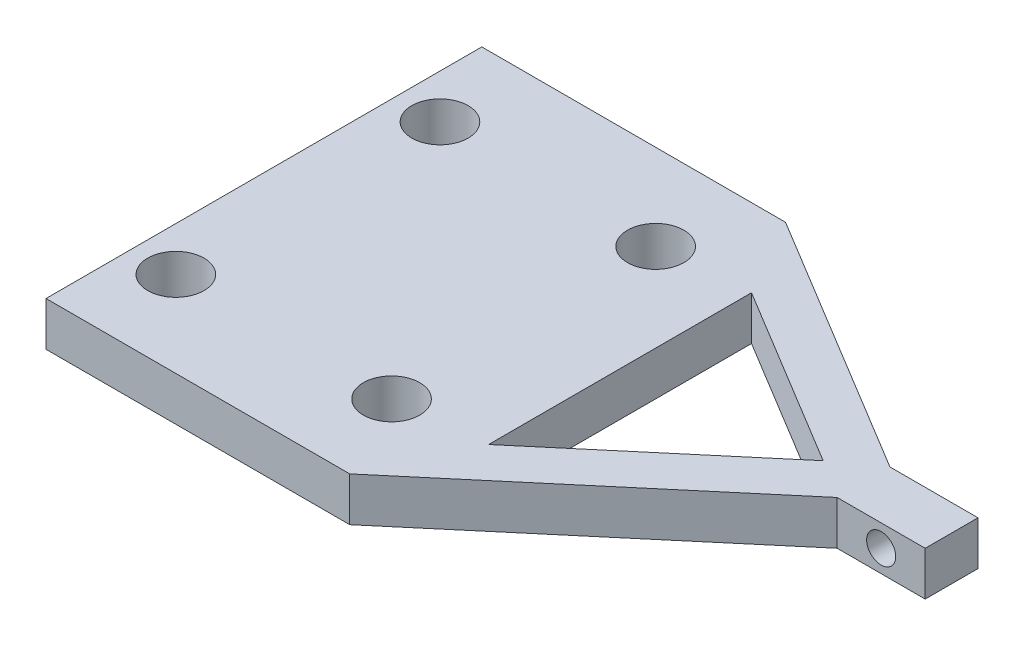
ISO-10303-21;
HEADER;
FILE_DESCRIPTION(('STEP AP214'),'2;1');
FILE_NAME('part.step','',(''),(''),'','','');
FILE_SCHEMA(('AUTOMOTIVE_DESIGN { 1 0 10303 214 1 1 1 1 }'));
ENDSEC;
DATA;
#1=APPLICATION_CONTEXT('core data for automotive mechanical design processes');
#2=APPLICATION_PROTOCOL_DEFINITION('international standard','automotive_design',2000,#1);
#3=PRODUCT_CONTEXT('',#1,'mechanical');
#4=PRODUCT('Part','Part','',(#3));
#5=PRODUCT_RELATED_PRODUCT_CATEGORY('part','',(#4));
#6=PRODUCT_DEFINITION_FORMATION('','',#4);
#7=PRODUCT_DEFINITION_CONTEXT('part definition',#1,'design');
#8=PRODUCT_DEFINITION('design','',#6,#7);
#9=PRODUCT_DEFINITION_SHAPE('','',#8);
#10=(LENGTH_UNIT() NAMED_UNIT(*) SI_UNIT(.MILLI.,.METRE.));
#11=(NAMED_UNIT(*) PLANE_ANGLE_UNIT() SI_UNIT($,.RADIAN.));
#12=(NAMED_UNIT(*) SI_UNIT($,.STERADIAN.) SOLID_ANGLE_UNIT());
#13=UNCERTAINTY_MEASURE_WITH_UNIT(LENGTH_MEASURE(1.E-05),#10,'distance_accuracy_value','');
#14=(GEOMETRIC_REPRESENTATION_CONTEXT(3) GLOBAL_UNCERTAINTY_ASSIGNED_CONTEXT((#13)) GLOBAL_UNIT_ASSIGNED_CONTEXT((#10,
#11,#12)) REPRESENTATION_CONTEXT('',''));
#15=CARTESIAN_POINT('',(0.,0.,0.));
#16=DIRECTION('',(0.,0.,1.));
#17=DIRECTION('',(1.,0.,0.));
#18=AXIS2_PLACEMENT_3D('',#15,#16,#17);
#19=CARTESIAN_POINT('',(0.,5.,0.));
#20=DIRECTION('',(1.,0.,0.));
#21=DIRECTION('',(0.,0.,-1.));
#22=AXIS2_PLACEMENT_3D('',#19,#20,#21);
#23=PLANE('',#22);
#24=DIRECTION('',(0.,0.,1.));
#25=VECTOR('',#24,1.);
#26=CARTESIAN_POINT('',(0.,0.,0.));
#27=LINE('',#26,#25);
#28=CARTESIAN_POINT('',(0.,0.,-49.5));
#29=VERTEX_POINT('',#28);
#30=CARTESIAN_POINT('',(0.,0.,0.));
#31=VERTEX_POINT('',#30);
#32=EDGE_CURVE('E225',#29,#31,#27,.T.);
#33=ORIENTED_EDGE('',*,*,#32,.T.);
#34=DIRECTION('',(0.,-1.,0.));
#35=VECTOR('',#34,1.);
#36=CARTESIAN_POINT('',(0.,5.,0.));
#37=LINE('',#36,#35);
#38=CARTESIAN_POINT('',(0.,5.,0.));
#39=VERTEX_POINT('',#38);
#40=EDGE_CURVE('E12',#39,#31,#37,.T.);
#41=ORIENTED_EDGE('',*,*,#40,.F.);
#42=DIRECTION('',(0.,0.,1.));
#43=VECTOR('',#42,1.);
#44=CARTESIAN_POINT('',(0.,5.,0.));
#45=LINE('',#44,#43);
#46=CARTESIAN_POINT('',(0.,5.,-49.5));
#47=VERTEX_POINT('',#46);
#48=EDGE_CURVE('E228',#47,#39,#45,.T.);
#49=ORIENTED_EDGE('',*,*,#48,.F.);
#50=DIRECTION('',(0.,-1.,0.));
#51=VECTOR('',#50,1.);
#52=CARTESIAN_POINT('',(0.,5.,-49.5));
#53=LINE('',#52,#51);
#54=EDGE_CURVE('E233',#47,#29,#53,.T.);
#55=ORIENTED_EDGE('',*,*,#54,.T.);
#56=EDGE_LOOP('',(#33,#41,#49,#55));
#57=FACE_BOUND('',#56,.T.);
#58=ADVANCED_FACE('F64',(#57),#23,.F.);
#59=CARTESIAN_POINT('',(0.,5.,0.));
#60=DIRECTION('',(0.,0.,-1.));
#61=DIRECTION('',(-1.,0.,0.));
#62=AXIS2_PLACEMENT_3D('',#59,#60,#61);
#63=PLANE('',#62);
#64=DIRECTION('',(1.,0.,0.));
#65=VECTOR('',#64,1.);
#66=CARTESIAN_POINT('',(0.,0.,0.));
#67=LINE('',#66,#65);
#68=CARTESIAN_POINT('',(34.5,0.,0.));
#69=VERTEX_POINT('',#68);
#70=EDGE_CURVE('E92',#31,#69,#67,.T.);
#71=ORIENTED_EDGE('',*,*,#70,.T.);
#72=DIRECTION('',(0.,-1.,0.));
#73=VECTOR('',#72,1.);
#74=CARTESIAN_POINT('',(34.5,5.,0.));
#75=LINE('',#74,#73);
#76=CARTESIAN_POINT('',(34.5,5.,0.));
#77=VERTEX_POINT('',#76);
#78=EDGE_CURVE('E72',#77,#69,#75,.T.);
#79=ORIENTED_EDGE('',*,*,#78,.F.);
#80=DIRECTION('',(1.,0.,0.));
#81=VECTOR('',#80,1.);
#82=CARTESIAN_POINT('',(0.,5.,0.));
#83=LINE('',#82,#81);
#84=EDGE_CURVE('E230',#39,#77,#83,.T.);
#85=ORIENTED_EDGE('',*,*,#84,.F.);
#86=ORIENTED_EDGE('',*,*,#40,.T.);
#87=EDGE_LOOP('',(#71,#79,#85,#86));
#88=FACE_BOUND('',#87,.T.);
#89=ADVANCED_FACE('F248',(#88),#63,.F.);
#90=CARTESIAN_POINT('',(0.,5.,-49.5));
#91=DIRECTION('',(0.,0.,1.));
#92=DIRECTION('',(1.,0.,0.));
#93=AXIS2_PLACEMENT_3D('',#90,#91,#92);
#94=PLANE('',#93);
#95=DIRECTION('',(-1.,0.,0.));
#96=VECTOR('',#95,1.);
#97=CARTESIAN_POINT('',(0.,0.,-49.5));
#98=LINE('',#97,#96);
#99=CARTESIAN_POINT('',(34.5,0.,-49.5));
#100=VERTEX_POINT('',#99);
#101=EDGE_CURVE('E97',#100,#29,#98,.T.);
#102=ORIENTED_EDGE('',*,*,#101,.T.);
#103=ORIENTED_EDGE('',*,*,#54,.F.);
#104=DIRECTION('',(-1.,0.,0.));
#105=VECTOR('',#104,1.);
#106=CARTESIAN_POINT('',(0.,5.,-49.5));
#107=LINE('',#106,#105);
#108=CARTESIAN_POINT('',(34.5,5.,-49.5));
#109=VERTEX_POINT('',#108);
#110=EDGE_CURVE('E80',#109,#47,#107,.T.);
#111=ORIENTED_EDGE('',*,*,#110,.F.);
#112=DIRECTION('',(0.,-1.,0.));
#113=VECTOR('',#112,1.);
#114=CARTESIAN_POINT('',(34.5,5.,-49.5));
#115=LINE('',#114,#113);
#116=EDGE_CURVE('E240',#109,#100,#115,.T.);
#117=ORIENTED_EDGE('',*,*,#116,.T.);
#118=EDGE_LOOP('',(#102,#103,#111,#117));
#119=FACE_BOUND('',#118,.T.);
#120=ADVANCED_FACE('F293',(#119),#94,.F.);
#121=CARTESIAN_POINT('',(0.,5.,0.));
#122=DIRECTION('',(0.,-1.,0.));
#123=DIRECTION('',(0.,0.,-1.));
#124=AXIS2_PLACEMENT_3D('',#121,#122,#123);
#125=PLANE('',#124);
#126=ORIENTED_EDGE('',*,*,#84,.T.);
#127=DIRECTION('',(0.763688088911531,0.,-0.645585395478131));
#128=VECTOR('',#127,1.);
#129=CARTESIAN_POINT('',(34.5,5.,0.));
#130=LINE('',#129,#128);
#131=CARTESIAN_POINT('',(64.5,5.,-25.3605655837164));
#132=VERTEX_POINT('',#131);
#133=EDGE_CURVE('E187',#77,#132,#130,.T.);
#134=ORIENTED_EDGE('',*,*,#133,.T.);
#135=DIRECTION('',(-1.,0.,0.));
#136=VECTOR('',#135,1.);
#137=CARTESIAN_POINT('',(74.5,5.,-25.3605655837164));
#138=LINE('',#137,#136);
#139=CARTESIAN_POINT('',(74.5,5.,-25.3605655837164));
#140=VERTEX_POINT('',#139);
#141=EDGE_CURVE('E192',#140,#132,#138,.T.);
#142=ORIENTED_EDGE('',*,*,#141,.F.);
#143=DIRECTION('',(0.,0.,1.));
#144=VECTOR('',#143,1.);
#145=CARTESIAN_POINT('',(74.5,5.,-31.3605655837164));
#146=LINE('',#145,#144);
#147=CARTESIAN_POINT('',(74.5,5.,-31.3605655837164));
#148=VERTEX_POINT('',#147);
#149=EDGE_CURVE('E196',#148,#140,#146,.T.);
#150=ORIENTED_EDGE('',*,*,#149,.F.);
#151=DIRECTION('',(-1.,0.,0.));
#152=VECTOR('',#151,1.);
#153=CARTESIAN_POINT('',(74.5,5.,-31.3605655837164));
#154=LINE('',#153,#152);
#155=CARTESIAN_POINT('',(64.5,5.,-31.3605655837164));
#156=VERTEX_POINT('',#155);
#157=EDGE_CURVE('E266',#148,#156,#154,.T.);
#158=ORIENTED_EDGE('',*,*,#157,.T.);
#159=DIRECTION('',(-0.855733252464875,0.,-0.517417240363989));
#160=VECTOR('',#159,1.);
#161=CARTESIAN_POINT('',(64.5,5.,-31.3605655837164));
#162=LINE('',#161,#160);
#163=EDGE_CURVE('E264',#156,#109,#162,.T.);
#164=ORIENTED_EDGE('',*,*,#163,.T.);
#165=ORIENTED_EDGE('',*,*,#110,.T.);
#166=ORIENTED_EDGE('',*,*,#48,.T.);
#167=EDGE_LOOP('',(#126,#134,#142,#150,#158,#164,#165,#166));
#168=FACE_BOUND('',#167,.T.);
#169=CARTESIAN_POINT('',(29.5,5.,-39.75));
#170=DIRECTION('',(0.,1.,0.));
#171=DIRECTION('',(0.,0.,-1.));
#172=AXIS2_PLACEMENT_3D('',#169,#170,#171);
#173=CIRCLE('',#172,3.2);
#174=CARTESIAN_POINT('',(29.5,5.,-42.95));
#175=VERTEX_POINT('',#174);
#176=EDGE_CURVE('E217',#175,#175,#173,.T.);
#177=ORIENTED_EDGE('',*,*,#176,.F.);
#178=EDGE_LOOP('',(#177));
#179=FACE_BOUND('',#178,.T.);
#180=CARTESIAN_POINT('',(29.5,5.,-9.75));
#181=DIRECTION('',(0.,1.,0.));
#182=DIRECTION('',(0.,0.,1.));
#183=AXIS2_PLACEMENT_3D('',#180,#181,#182);
#184=CIRCLE('',#183,3.2);
#185=CARTESIAN_POINT('',(29.5,5.,-6.55));
#186=VERTEX_POINT('',#185);
#187=EDGE_CURVE('E211',#186,#186,#184,.T.);
#188=ORIENTED_EDGE('',*,*,#187,.F.);
#189=EDGE_LOOP('',(#188));
#190=FACE_BOUND('',#189,.T.);
#191=CARTESIAN_POINT('',(5.,5.,-9.75));
#192=DIRECTION('',(0.,1.,0.));
#193=DIRECTION('',(0.,0.,-1.));
#194=AXIS2_PLACEMENT_3D('',#191,#192,#193);
#195=CIRCLE('',#194,3.2);
#196=CARTESIAN_POINT('',(5.,5.,-12.95));
#197=VERTEX_POINT('',#196);
#198=EDGE_CURVE('E204',#197,#197,#195,.T.);
#199=ORIENTED_EDGE('',*,*,#198,.F.);
#200=EDGE_LOOP('',(#199));
#201=FACE_BOUND('',#200,.T.);
#202=CARTESIAN_POINT('',(5.,5.,-39.75));
#203=DIRECTION('',(0.,1.,0.));
#204=DIRECTION('',(0.,0.,1.));
#205=AXIS2_PLACEMENT_3D('',#202,#203,#204);
#206=CIRCLE('',#205,3.2);
#207=CARTESIAN_POINT('',(5.,5.,-36.55));
#208=VERTEX_POINT('',#207);
#209=EDGE_CURVE('E207',#208,#208,#206,.T.);
#210=ORIENTED_EDGE('',*,*,#209,.F.);
#211=EDGE_LOOP('',(#210));
#212=FACE_BOUND('',#211,.T.);
#213=DIRECTION('',(0.763688088911531,0.,-0.645585395478131));
#214=VECTOR('',#213,1.);
#215=CARTESIAN_POINT('',(39.5,5.,-10.7739365021625));
#216=LINE('',#215,#214);
#217=CARTESIAN_POINT('',(39.5,5.,-10.7739365021625));
#218=VERTEX_POINT('',#217);
#219=CARTESIAN_POINT('',(60.09302217234,5.,-28.1822928144477));
#220=VERTEX_POINT('',#219);
#221=EDGE_CURVE('E155',#218,#220,#216,.T.);
#222=ORIENTED_EDGE('',*,*,#221,.F.);
#223=DIRECTION('',(0.,0.,1.));
#224=VECTOR('',#223,1.);
#225=CARTESIAN_POINT('',(39.5,5.,-40.6338186520555));
#226=LINE('',#225,#224);
#227=CARTESIAN_POINT('',(39.5,5.,-40.6338186520555));
#228=VERTEX_POINT('',#227);
#229=EDGE_CURVE('E160',#228,#218,#226,.T.);
#230=ORIENTED_EDGE('',*,*,#229,.F.);
#231=DIRECTION('',(-0.855733252464875,0.,-0.517417240363989));
#232=VECTOR('',#231,1.);
#233=CARTESIAN_POINT('',(60.09302217234,5.,-28.1822928144477));
#234=LINE('',#233,#232);
#235=EDGE_CURVE('E159',#220,#228,#234,.T.);
#236=ORIENTED_EDGE('',*,*,#235,.F.);
#237=EDGE_LOOP('',(#222,#230,#236));
#238=FACE_BOUND('',#237,.T.);
#239=ADVANCED_FACE('F262',(#168,#179,#190,#201,#212,#238),#125,.F.);
#240=CARTESIAN_POINT('',(0.,0.,0.));
#241=DIRECTION('',(0.,-1.,0.));
#242=DIRECTION('',(0.,0.,-1.));
#243=AXIS2_PLACEMENT_3D('',#240,#241,#242);
#244=PLANE('',#243);
#245=ORIENTED_EDGE('',*,*,#101,.F.);
#246=DIRECTION('',(-0.855733252464876,0.,-0.517417240363989));
#247=VECTOR('',#246,1.);
#248=CARTESIAN_POINT('',(64.5,0.,-31.3605655837164));
#249=LINE('',#248,#247);
#250=CARTESIAN_POINT('',(64.5,0.,-31.3605655837164));
#251=VERTEX_POINT('',#250);
#252=EDGE_CURVE('E177',#251,#100,#249,.T.);
#253=ORIENTED_EDGE('',*,*,#252,.F.);
#254=DIRECTION('',(-1.,0.,0.));
#255=VECTOR('',#254,1.);
#256=CARTESIAN_POINT('',(74.5,0.,-31.3605655837164));
#257=LINE('',#256,#255);
#258=CARTESIAN_POINT('',(74.5,0.,-31.3605655837164));
#259=VERTEX_POINT('',#258);
#260=EDGE_CURVE('E180',#259,#251,#257,.T.);
#261=ORIENTED_EDGE('',*,*,#260,.F.);
#262=DIRECTION('',(0.,0.,1.));
#263=VECTOR('',#262,1.);
#264=CARTESIAN_POINT('',(74.5,0.,-31.3605655837164));
#265=LINE('',#264,#263);
#266=CARTESIAN_POINT('',(74.5,0.,-25.3605655837164));
#267=VERTEX_POINT('',#266);
#268=EDGE_CURVE('E185',#259,#267,#265,.T.);
#269=ORIENTED_EDGE('',*,*,#268,.T.);
#270=DIRECTION('',(-1.,0.,0.));
#271=VECTOR('',#270,1.);
#272=CARTESIAN_POINT('',(74.5,0.,-25.3605655837164));
#273=LINE('',#272,#271);
#274=CARTESIAN_POINT('',(64.5,0.,-25.3605655837164));
#275=VERTEX_POINT('',#274);
#276=EDGE_CURVE('E174',#267,#275,#273,.T.);
#277=ORIENTED_EDGE('',*,*,#276,.T.);
#278=DIRECTION('',(0.763688088911531,0.,-0.645585395478131));
#279=VECTOR('',#278,1.);
#280=CARTESIAN_POINT('',(34.5,0.,0.));
#281=LINE('',#280,#279);
#282=EDGE_CURVE('E189',#69,#275,#281,.T.);
#283=ORIENTED_EDGE('',*,*,#282,.F.);
#284=ORIENTED_EDGE('',*,*,#70,.F.);
#285=ORIENTED_EDGE('',*,*,#32,.F.);
#286=EDGE_LOOP('',(#245,#253,#261,#269,#277,#283,#284,#285));
#287=FACE_BOUND('',#286,.T.);
#288=CARTESIAN_POINT('',(29.5,0.,-39.75));
#289=DIRECTION('',(0.,1.,0.));
#290=DIRECTION('',(0.,0.,-1.));
#291=AXIS2_PLACEMENT_3D('',#288,#289,#290);
#292=CIRCLE('',#291,3.2);
#293=CARTESIAN_POINT('',(29.5,0.,-42.95));
#294=VERTEX_POINT('',#293);
#295=EDGE_CURVE('E169',#294,#294,#292,.T.);
#296=ORIENTED_EDGE('',*,*,#295,.T.);
#297=EDGE_LOOP('',(#296));
#298=FACE_BOUND('',#297,.T.);
#299=CARTESIAN_POINT('',(29.5,0.,-9.75));
#300=DIRECTION('',(0.,1.,0.));
#301=DIRECTION('',(0.,0.,1.));
#302=AXIS2_PLACEMENT_3D('',#299,#300,#301);
#303=CIRCLE('',#302,3.2);
#304=CARTESIAN_POINT('',(29.5,0.,-6.55));
#305=VERTEX_POINT('',#304);
#306=EDGE_CURVE('E214',#305,#305,#303,.T.);
#307=ORIENTED_EDGE('',*,*,#306,.T.);
#308=EDGE_LOOP('',(#307));
#309=FACE_BOUND('',#308,.T.);
#310=CARTESIAN_POINT('',(5.,0.,-9.75));
#311=DIRECTION('',(0.,1.,0.));
#312=DIRECTION('',(0.,0.,-1.));
#313=AXIS2_PLACEMENT_3D('',#310,#311,#312);
#314=CIRCLE('',#313,3.2);
#315=CARTESIAN_POINT('',(5.,0.,-12.95));
#316=VERTEX_POINT('',#315);
#317=EDGE_CURVE('E208',#316,#316,#314,.T.);
#318=ORIENTED_EDGE('',*,*,#317,.T.);
#319=EDGE_LOOP('',(#318));
#320=FACE_BOUND('',#319,.T.);
#321=CARTESIAN_POINT('',(5.,0.,-39.75));
#322=DIRECTION('',(0.,1.,0.));
#323=DIRECTION('',(0.,0.,1.));
#324=AXIS2_PLACEMENT_3D('',#321,#322,#323);
#325=CIRCLE('',#324,3.2);
#326=CARTESIAN_POINT('',(5.,0.,-36.55));
#327=VERTEX_POINT('',#326);
#328=EDGE_CURVE('E222',#327,#327,#325,.T.);
#329=ORIENTED_EDGE('',*,*,#328,.T.);
#330=EDGE_LOOP('',(#329));
#331=FACE_BOUND('',#330,.T.);
#332=DIRECTION('',(0.,0.,1.));
#333=VECTOR('',#332,1.);
#334=CARTESIAN_POINT('',(39.5,0.,-40.6338186520555));
#335=LINE('',#334,#333);
#336=CARTESIAN_POINT('',(39.5,0.,-40.6338186520555));
#337=VERTEX_POINT('',#336);
#338=CARTESIAN_POINT('',(39.5,0.,-10.7739365021625));
#339=VERTEX_POINT('',#338);
#340=EDGE_CURVE('E172',#337,#339,#335,.T.);
#341=ORIENTED_EDGE('',*,*,#340,.T.);
#342=DIRECTION('',(0.763688088911531,0.,-0.645585395478131));
#343=VECTOR('',#342,1.);
#344=CARTESIAN_POINT('',(39.5,0.,-10.7739365021625));
#345=LINE('',#344,#343);
#346=CARTESIAN_POINT('',(60.09302217234,0.,-28.1822928144477));
#347=VERTEX_POINT('',#346);
#348=EDGE_CURVE('E152',#339,#347,#345,.T.);
#349=ORIENTED_EDGE('',*,*,#348,.T.);
#350=DIRECTION('',(-0.855733252464875,0.,-0.517417240363989));
#351=VECTOR('',#350,1.);
#352=CARTESIAN_POINT('',(60.09302217234,0.,-28.1822928144477));
#353=LINE('',#352,#351);
#354=EDGE_CURVE('E163',#347,#337,#353,.T.);
#355=ORIENTED_EDGE('',*,*,#354,.T.);
#356=EDGE_LOOP('',(#341,#349,#355));
#357=FACE_BOUND('',#356,.T.);
#358=ADVANCED_FACE('F171',(#287,#298,#309,#320,#331,#357),#244,.T.);
#359=CARTESIAN_POINT('',(5.,0.,-39.75));
#360=DIRECTION('',(0.,1.,0.));
#361=DIRECTION('',(0.,0.,1.));
#362=AXIS2_PLACEMENT_3D('',#359,#360,#361);
#363=CYLINDRICAL_SURFACE('',#362,3.2);
#364=ORIENTED_EDGE('',*,*,#328,.F.);
#365=EDGE_LOOP('',(#364));
#366=FACE_BOUND('',#365,.T.);
#367=ORIENTED_EDGE('',*,*,#209,.T.);
#368=EDGE_LOOP('',(#367));
#369=FACE_BOUND('',#368,.T.);
#370=ADVANCED_FACE('F425',(#366,#369),#363,.F.);
#371=CARTESIAN_POINT('',(5.,0.,-9.75));
#372=DIRECTION('',(0.,1.,0.));
#373=DIRECTION('',(0.,0.,1.));
#374=AXIS2_PLACEMENT_3D('',#371,#372,#373);
#375=CYLINDRICAL_SURFACE('',#374,3.2);
#376=ORIENTED_EDGE('',*,*,#317,.F.);
#377=EDGE_LOOP('',(#376));
#378=FACE_BOUND('',#377,.T.);
#379=ORIENTED_EDGE('',*,*,#198,.T.);
#380=EDGE_LOOP('',(#379));
#381=FACE_BOUND('',#380,.T.);
#382=ADVANCED_FACE('F415',(#378,#381),#375,.F.);
#383=CARTESIAN_POINT('',(29.5,0.,-9.75));
#384=DIRECTION('',(0.,1.,0.));
#385=DIRECTION('',(0.,0.,1.));
#386=AXIS2_PLACEMENT_3D('',#383,#384,#385);
#387=CYLINDRICAL_SURFACE('',#386,3.2);
#388=ORIENTED_EDGE('',*,*,#306,.F.);
#389=EDGE_LOOP('',(#388));
#390=FACE_BOUND('',#389,.T.);
#391=ORIENTED_EDGE('',*,*,#187,.T.);
#392=EDGE_LOOP('',(#391));
#393=FACE_BOUND('',#392,.T.);
#394=ADVANCED_FACE('F331',(#390,#393),#387,.F.);
#395=CARTESIAN_POINT('',(29.5,0.,-39.75));
#396=DIRECTION('',(0.,1.,0.));
#397=DIRECTION('',(0.,0.,1.));
#398=AXIS2_PLACEMENT_3D('',#395,#396,#397);
#399=CYLINDRICAL_SURFACE('',#398,3.2);
#400=ORIENTED_EDGE('',*,*,#295,.F.);
#401=EDGE_LOOP('',(#400));
#402=FACE_BOUND('',#401,.T.);
#403=ORIENTED_EDGE('',*,*,#176,.T.);
#404=EDGE_LOOP('',(#403));
#405=FACE_BOUND('',#404,.T.);
#406=ADVANCED_FACE('F326',(#402,#405),#399,.F.);
#407=CARTESIAN_POINT('',(74.5,-63.641574461982,-31.3605655837164));
#408=DIRECTION('',(0.,0.,-1.));
#409=DIRECTION('',(-1.,0.,0.));
#410=AXIS2_PLACEMENT_3D('',#407,#408,#409);
#411=PLANE('',#410);
#412=CARTESIAN_POINT('',(69.5,2.5,-31.3605655837164));
#413=DIRECTION('',(0.,0.,-1.));
#414=DIRECTION('',(-1.,0.,0.));
#415=AXIS2_PLACEMENT_3D('',#412,#413,#414);
#416=CIRCLE('',#415,1.65);
#417=CARTESIAN_POINT('',(67.85,2.5,-31.3605655837164));
#418=VERTEX_POINT('',#417);
#419=EDGE_CURVE('E184',#418,#418,#416,.T.);
#420=ORIENTED_EDGE('',*,*,#419,.F.);
#421=EDGE_LOOP('',(#420));
#422=FACE_BOUND('',#421,.T.);
#423=DIRECTION('',(0.,1.,0.));
#424=VECTOR('',#423,1.);
#425=CARTESIAN_POINT('',(74.5,-63.641574461982,-31.3605655837164));
#426=LINE('',#425,#424);
#427=EDGE_CURVE('E194',#259,#148,#426,.T.);
#428=ORIENTED_EDGE('',*,*,#427,.F.);
#429=ORIENTED_EDGE('',*,*,#260,.T.);
#430=DIRECTION('',(0.,1.,0.));
#431=VECTOR('',#430,1.);
#432=CARTESIAN_POINT('',(64.5,-63.641574461982,-31.3605655837164));
#433=LINE('',#432,#431);
#434=EDGE_CURVE('E183',#251,#156,#433,.T.);
#435=ORIENTED_EDGE('',*,*,#434,.T.);
#436=ORIENTED_EDGE('',*,*,#157,.F.);
#437=EDGE_LOOP('',(#428,#429,#435,#436));
#438=FACE_BOUND('',#437,.T.);
#439=ADVANCED_FACE('F303',(#422,#438),#411,.T.);
#440=CARTESIAN_POINT('',(74.5,-63.641574461982,-31.3605655837164));
#441=DIRECTION('',(-1.,0.,0.));
#442=DIRECTION('',(0.,0.,1.));
#443=AXIS2_PLACEMENT_3D('',#440,#441,#442);
#444=PLANE('',#443);
#445=ORIENTED_EDGE('',*,*,#268,.F.);
#446=ORIENTED_EDGE('',*,*,#427,.T.);
#447=ORIENTED_EDGE('',*,*,#149,.T.);
#448=DIRECTION('',(0.,1.,0.));
#449=VECTOR('',#448,1.);
#450=CARTESIAN_POINT('',(74.5,-63.641574461982,-25.3605655837164));
#451=LINE('',#450,#449);
#452=EDGE_CURVE('E197',#267,#140,#451,.T.);
#453=ORIENTED_EDGE('',*,*,#452,.F.);
#454=EDGE_LOOP('',(#445,#446,#447,#453));
#455=FACE_BOUND('',#454,.T.);
#456=ADVANCED_FACE('F306',(#455),#444,.F.);
#457=CARTESIAN_POINT('',(74.5,-63.641574461982,-25.3605655837164));
#458=DIRECTION('',(0.,0.,-1.));
#459=DIRECTION('',(-1.,0.,0.));
#460=AXIS2_PLACEMENT_3D('',#457,#458,#459);
#461=PLANE('',#460);
#462=CARTESIAN_POINT('',(69.5,2.5,-25.3605655837164));
#463=DIRECTION('',(0.,0.,1.));
#464=DIRECTION('',(1.,0.,0.));
#465=AXIS2_PLACEMENT_3D('',#462,#463,#464);
#466=CIRCLE('',#465,1.65);
#467=CARTESIAN_POINT('',(71.15,2.5,-25.3605655837164));
#468=VERTEX_POINT('',#467);
#469=EDGE_CURVE('E310',#468,#468,#466,.T.);
#470=ORIENTED_EDGE('',*,*,#469,.F.);
#471=EDGE_LOOP('',(#470));
#472=FACE_BOUND('',#471,.T.);
#473=ORIENTED_EDGE('',*,*,#276,.F.);
#474=ORIENTED_EDGE('',*,*,#452,.T.);
#475=ORIENTED_EDGE('',*,*,#141,.T.);
#476=DIRECTION('',(0.,1.,0.));
#477=VECTOR('',#476,1.);
#478=CARTESIAN_POINT('',(64.5,-63.641574461982,-25.3605655837164));
#479=LINE('',#478,#477);
#480=EDGE_CURVE('E191',#275,#132,#479,.T.);
#481=ORIENTED_EDGE('',*,*,#480,.F.);
#482=EDGE_LOOP('',(#473,#474,#475,#481));
#483=FACE_BOUND('',#482,.T.);
#484=ADVANCED_FACE('F257',(#472,#483),#461,.F.);
#485=CARTESIAN_POINT('',(34.5,-63.641574461982,0.));
#486=DIRECTION('',(0.645585395478131,0.,0.763688088911531));
#487=DIRECTION('',(0.763688088911531,0.,-0.645585395478131));
#488=AXIS2_PLACEMENT_3D('',#485,#486,#487);
#489=PLANE('',#488);
#490=ORIENTED_EDGE('',*,*,#78,.T.);
#491=ORIENTED_EDGE('',*,*,#282,.T.);
#492=ORIENTED_EDGE('',*,*,#480,.T.);
#493=ORIENTED_EDGE('',*,*,#133,.F.);
#494=EDGE_LOOP('',(#490,#491,#492,#493));
#495=FACE_BOUND('',#494,.T.);
#496=ADVANCED_FACE('F245',(#495),#489,.T.);
#497=CARTESIAN_POINT('',(64.5,-63.641574461982,-31.3605655837164));
#498=DIRECTION('',(0.517417240363989,0.,-0.855733252464875));
#499=DIRECTION('',(-0.855733252464876,0.,-0.517417240363989));
#500=AXIS2_PLACEMENT_3D('',#497,#498,#499);
#501=PLANE('',#500);
#502=ORIENTED_EDGE('',*,*,#434,.F.);
#503=ORIENTED_EDGE('',*,*,#252,.T.);
#504=ORIENTED_EDGE('',*,*,#116,.F.);
#505=ORIENTED_EDGE('',*,*,#163,.F.);
#506=EDGE_LOOP('',(#502,#503,#504,#505));
#507=FACE_BOUND('',#506,.T.);
#508=ADVANCED_FACE('F286',(#507),#501,.T.);
#509=CARTESIAN_POINT('',(39.5,-63.641574461982,-10.7739365021625));
#510=DIRECTION('',(0.645585395478131,0.,0.763688088911531));
#511=DIRECTION('',(0.763688088911531,0.,-0.645585395478131));
#512=AXIS2_PLACEMENT_3D('',#509,#510,#511);
#513=PLANE('',#512);
#514=ORIENTED_EDGE('',*,*,#348,.F.);
#515=DIRECTION('',(0.,1.,0.));
#516=VECTOR('',#515,1.);
#517=CARTESIAN_POINT('',(39.5,-63.641574461982,-10.7739365021625));
#518=LINE('',#517,#516);
#519=EDGE_CURVE('E201',#339,#218,#518,.T.);
#520=ORIENTED_EDGE('',*,*,#519,.T.);
#521=ORIENTED_EDGE('',*,*,#221,.T.);
#522=DIRECTION('',(0.,1.,0.));
#523=VECTOR('',#522,1.);
#524=CARTESIAN_POINT('',(60.09302217234,-63.641574461982,-28.1822928144477));
#525=LINE('',#524,#523);
#526=EDGE_CURVE('E148',#347,#220,#525,.T.);
#527=ORIENTED_EDGE('',*,*,#526,.F.);
#528=EDGE_LOOP('',(#514,#520,#521,#527));
#529=FACE_BOUND('',#528,.T.);
#530=ADVANCED_FACE('F150',(#529),#513,.F.);
#531=CARTESIAN_POINT('',(39.5,-63.641574461982,-40.6338186520555));
#532=DIRECTION('',(-1.,0.,0.));
#533=DIRECTION('',(0.,0.,1.));
#534=AXIS2_PLACEMENT_3D('',#531,#532,#533);
#535=PLANE('',#534);
#536=ORIENTED_EDGE('',*,*,#340,.F.);
#537=DIRECTION('',(0.,1.,0.));
#538=VECTOR('',#537,1.);
#539=CARTESIAN_POINT('',(39.5,-63.641574461982,-40.6338186520555));
#540=LINE('',#539,#538);
#541=EDGE_CURVE('E165',#337,#228,#540,.T.);
#542=ORIENTED_EDGE('',*,*,#541,.T.);
#543=ORIENTED_EDGE('',*,*,#229,.T.);
#544=ORIENTED_EDGE('',*,*,#519,.F.);
#545=EDGE_LOOP('',(#536,#542,#543,#544));
#546=FACE_BOUND('',#545,.T.);
#547=ADVANCED_FACE('F277',(#546),#535,.F.);
#548=CARTESIAN_POINT('',(60.09302217234,-63.641574461982,-28.1822928144477));
#549=DIRECTION('',(0.517417240363989,0.,-0.855733252464875));
#550=DIRECTION('',(-0.855733252464875,0.,-0.517417240363989));
#551=AXIS2_PLACEMENT_3D('',#548,#549,#550);
#552=PLANE('',#551);
#553=ORIENTED_EDGE('',*,*,#354,.F.);
#554=ORIENTED_EDGE('',*,*,#526,.T.);
#555=ORIENTED_EDGE('',*,*,#235,.T.);
#556=ORIENTED_EDGE('',*,*,#541,.F.);
#557=EDGE_LOOP('',(#553,#554,#555,#556));
#558=FACE_BOUND('',#557,.T.);
#559=ADVANCED_FACE('F164',(#558),#552,.F.);
#560=CARTESIAN_POINT('',(69.5,2.5,-35.3605655837164));
#561=DIRECTION('',(0.,0.,1.));
#562=DIRECTION('',(1.,0.,0.));
#563=AXIS2_PLACEMENT_3D('',#560,#561,#562);
#564=CYLINDRICAL_SURFACE('',#563,1.65);
#565=ORIENTED_EDGE('',*,*,#419,.T.);
#566=EDGE_LOOP('',(#565));
#567=FACE_BOUND('',#566,.T.);
#568=ORIENTED_EDGE('',*,*,#469,.T.);
#569=EDGE_LOOP('',(#568));
#570=FACE_BOUND('',#569,.T.);
#571=ADVANCED_FACE('F284',(#567,#570),#564,.F.);
#572=CLOSED_SHELL('',(#58,#89,#120,#239,#358,#370,#382,#394,#406,#439,#456,#484,#496,#508,#530,
#547,#559,#571));
#573=MANIFOLD_SOLID_BREP('B2',#572);
#574=ADVANCED_BREP_SHAPE_REPRESENTATION('',(#18,#573),#14);
#575=SHAPE_DEFINITION_REPRESENTATION(#9,#574);
ENDSEC;
END-ISO-10303-21;
